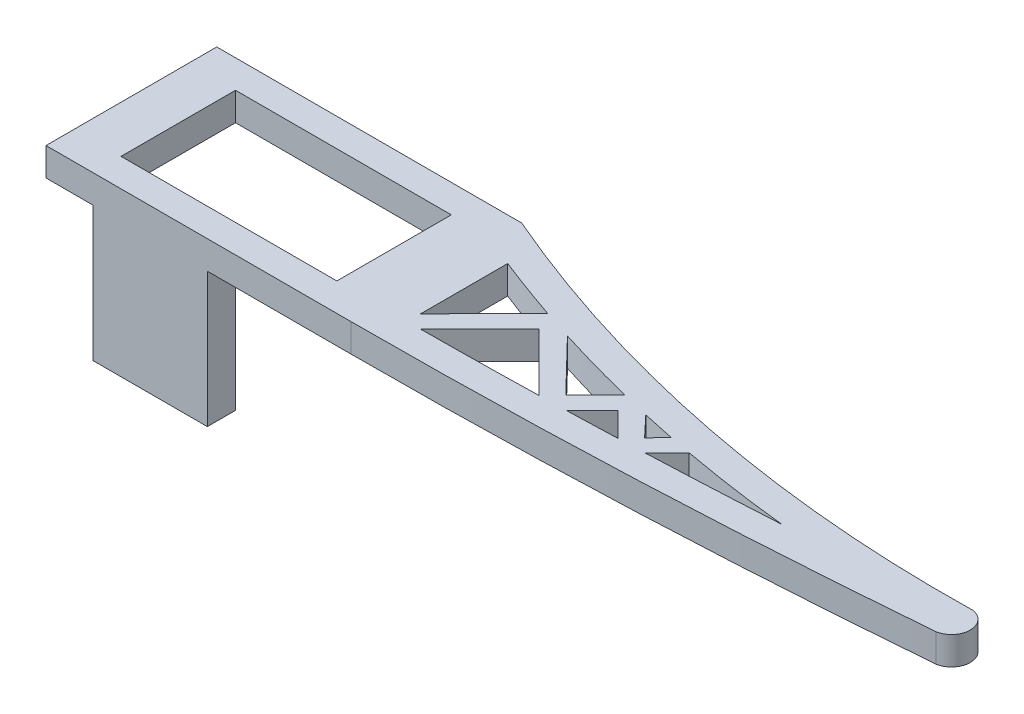
ISO-10303-21;
HEADER;
FILE_DESCRIPTION(('STEP AP214'),'2;1');
FILE_NAME('part.step','',(''),(''),'','','');
FILE_SCHEMA(('AUTOMOTIVE_DESIGN { 1 0 10303 214 1 1 1 1 }'));
ENDSEC;
DATA;
#1=APPLICATION_CONTEXT('core data for automotive mechanical design processes');
#2=APPLICATION_PROTOCOL_DEFINITION('international standard','automotive_design',2000,#1);
#3=PRODUCT_CONTEXT('',#1,'mechanical');
#4=PRODUCT('Part','Part','',(#3));
#5=PRODUCT_RELATED_PRODUCT_CATEGORY('part','',(#4));
#6=PRODUCT_DEFINITION_FORMATION('','',#4);
#7=PRODUCT_DEFINITION_CONTEXT('part definition',#1,'design');
#8=PRODUCT_DEFINITION('design','',#6,#7);
#9=PRODUCT_DEFINITION_SHAPE('','',#8);
#10=(LENGTH_UNIT() NAMED_UNIT(*) SI_UNIT(.MILLI.,.METRE.));
#11=(NAMED_UNIT(*) PLANE_ANGLE_UNIT() SI_UNIT($,.RADIAN.));
#12=(NAMED_UNIT(*) SI_UNIT($,.STERADIAN.) SOLID_ANGLE_UNIT());
#13=UNCERTAINTY_MEASURE_WITH_UNIT(LENGTH_MEASURE(1.E-05),#10,'distance_accuracy_value','');
#14=(GEOMETRIC_REPRESENTATION_CONTEXT(3) GLOBAL_UNCERTAINTY_ASSIGNED_CONTEXT((#13)) GLOBAL_UNIT_ASSIGNED_CONTEXT((#10,
#11,#12)) REPRESENTATION_CONTEXT('',''));
#15=CARTESIAN_POINT('',(0.,0.,0.));
#16=DIRECTION('',(0.,0.,1.));
#17=DIRECTION('',(1.,0.,0.));
#18=AXIS2_PLACEMENT_3D('',#15,#16,#17);
#19=CARTESIAN_POINT('',(16.25,0.,-692.267762496661));
#20=DIRECTION('',(0.,1.,0.));
#21=DIRECTION('',(0.,0.,1.));
#22=AXIS2_PLACEMENT_3D('',#19,#20,#21);
#23=PLANE('',#22);
#24=DIRECTION('',(0.70215886774458,0.,-0.712020311822387));
#25=VECTOR('',#24,1.);
#26=CARTESIAN_POINT('',(19.25,0.,4.57934188869029));
#27=LINE('',#26,#25);
#28=CARTESIAN_POINT('',(19.25,0.,4.57934188869025));
#29=VERTEX_POINT('',#28);
#30=CARTESIAN_POINT('',(25.977749380802,0.,-2.24289511782721));
#31=VERTEX_POINT('',#30);
#32=EDGE_CURVE('E458',#29,#31,#27,.T.);
#33=ORIENTED_EDGE('',*,*,#32,.T.);
#34=CARTESIAN_POINT('',(73.0415388145315,0.,-140.770806467442));
#35=DIRECTION('',(0.,-1.,0.));
#36=DIRECTION('',(0.,0.,1.));
#37=AXIS2_PLACEMENT_3D('',#34,#35,#36);
#38=CIRCLE('',#37,146.304417222274);
#39=CARTESIAN_POINT('',(19.25,0.,-4.71400637750197));
#40=VERTEX_POINT('',#39);
#41=EDGE_CURVE('E449',#31,#40,#38,.T.);
#42=ORIENTED_EDGE('',*,*,#41,.T.);
#43=DIRECTION('',(0.,0.,1.));
#44=VECTOR('',#43,1.);
#45=CARTESIAN_POINT('',(19.25,0.,-4.71400637750197));
#46=LINE('',#45,#44);
#47=EDGE_CURVE('E453',#40,#29,#46,.T.);
#48=ORIENTED_EDGE('',*,*,#47,.T.);
#49=EDGE_LOOP('',(#33,#42,#48));
#50=FACE_BOUND('',#49,.T.);
#51=DIRECTION('',(0.6855739045721,0.,0.728003036648725));
#52=VECTOR('',#51,1.);
#53=CARTESIAN_POINT('',(40.5625292952941,0.,1.88295772894521));
#54=LINE('',#53,#52);
#55=CARTESIAN_POINT('',(40.5625292952941,0.,1.8829577289452));
#56=VERTEX_POINT('',#55);
#57=CARTESIAN_POINT('',(42.638111064004,0.,4.08699411416416));
#58=VERTEX_POINT('',#57);
#59=EDGE_CURVE('E291',#56,#58,#54,.T.);
#60=ORIENTED_EDGE('',*,*,#59,.T.);
#61=DIRECTION('',(0.688032215754689,0.,-0.725680143095905));
#62=VECTOR('',#61,1.);
#63=CARTESIAN_POINT('',(42.638111064004,0.,4.08699411416416));
#64=LINE('',#63,#62);
#65=CARTESIAN_POINT('',(44.0225307638828,0.,2.62682137383555));
#66=VERTEX_POINT('',#65);
#67=EDGE_CURVE('E299',#58,#66,#64,.T.);
#68=ORIENTED_EDGE('',*,*,#67,.T.);
#69=CARTESIAN_POINT('',(73.0415388145315,0.,-140.770806467442));
#70=DIRECTION('',(0.,-1.,0.));
#71=DIRECTION('',(0.,0.,1.));
#72=AXIS2_PLACEMENT_3D('',#69,#70,#71);
#73=CIRCLE('',#72,146.304417222274);
#74=EDGE_CURVE('E310',#66,#56,#73,.T.);
#75=ORIENTED_EDGE('',*,*,#74,.T.);
#76=EDGE_LOOP('',(#60,#68,#75));
#77=FACE_BOUND('',#76,.T.);
#78=CARTESIAN_POINT('',(16.2499999999498,0.,-692.26776249783));
#79=DIRECTION('',(0.,1.,0.));
#80=DIRECTION('',(0.,0.,1.));
#81=AXIS2_PLACEMENT_3D('',#78,#79,#80);
#82=CIRCLE('',#81,698.26776249783);
#83=CARTESIAN_POINT('',(44.1095240356003,0.,5.44400826731389));
#84=VERTEX_POINT('',#83);
#85=CARTESIAN_POINT('',(57.9534950298761,0.,4.75353319263505));
#86=VERTEX_POINT('',#85);
#87=EDGE_CURVE('E387',#84,#86,#82,.T.);
#88=ORIENTED_EDGE('',*,*,#87,.T.);
#89=CARTESIAN_POINT('',(73.0415388145315,0.,-140.770806467442));
#90=DIRECTION('',(0.,-1.,0.));
#91=DIRECTION('',(0.,0.,1.));
#92=AXIS2_PLACEMENT_3D('',#89,#90,#91);
#93=CIRCLE('',#92,146.304417222274);
#94=CARTESIAN_POINT('',(46.3950479740729,0.,3.08657785688982));
#95=VERTEX_POINT('',#94);
#96=EDGE_CURVE('E400',#86,#95,#93,.T.);
#97=ORIENTED_EDGE('',*,*,#96,.T.);
#98=DIRECTION('',(-0.696072187513183,0.,0.717971802907755));
#99=VECTOR('',#98,1.);
#100=CARTESIAN_POINT('',(44.1095240356003,0.,5.444008267314));
#101=LINE('',#100,#99);
#102=EDGE_CURVE('E411',#95,#84,#101,.T.);
#103=ORIENTED_EDGE('',*,*,#102,.T.);
#104=EDGE_LOOP('',(#88,#97,#103));
#105=FACE_BOUND('',#104,.T.);
#106=CARTESIAN_POINT('',(16.2499999999498,0.,-692.26776249783));
#107=DIRECTION('',(0.,1.,0.));
#108=DIRECTION('',(0.,0.,1.));
#109=AXIS2_PLACEMENT_3D('',#106,#107,#108);
#110=CIRCLE('',#109,698.26776249783);
#111=CARTESIAN_POINT('',(20.6717695466051,0.,5.98599946683154));
#112=VERTEX_POINT('',#111);
#113=CARTESIAN_POINT('',(33.1196036039778,0.,5.79619203496862));
#114=VERTEX_POINT('',#113);
#115=EDGE_CURVE('E422',#112,#114,#110,.T.);
#116=ORIENTED_EDGE('',*,*,#115,.T.);
#117=DIRECTION('',(-0.70710678118655,0.,-0.707106781186545));
#118=VECTOR('',#117,1.);
#119=CARTESIAN_POINT('',(26.9905902912229,0.,-0.33282127778641));
#120=LINE('',#119,#118);
#121=CARTESIAN_POINT('',(26.9905902912229,0.,-0.33282127778641));
#122=VERTEX_POINT('',#121);
#123=EDGE_CURVE('E433',#114,#122,#120,.T.);
#124=ORIENTED_EDGE('',*,*,#123,.T.);
#125=DIRECTION('',(-0.707106781186539,0.,0.707106781186556));
#126=VECTOR('',#125,1.);
#127=CARTESIAN_POINT('',(20.671769546605,0.,5.98599946683159));
#128=LINE('',#127,#126);
#129=EDGE_CURVE('E442',#122,#112,#128,.T.);
#130=ORIENTED_EDGE('',*,*,#129,.T.);
#131=EDGE_LOOP('',(#116,#124,#130));
#132=FACE_BOUND('',#131,.T.);
#133=DIRECTION('',(0.695538394909189,0.,0.718488929077651));
#134=VECTOR('',#133,1.);
#135=CARTESIAN_POINT('',(29.1123972203652,0.,-1.21718588542754));
#136=LINE('',#135,#134);
#137=CARTESIAN_POINT('',(29.1123972203652,0.,-1.21718588542755));
#138=VERTEX_POINT('',#137);
#139=CARTESIAN_POINT('',(34.4991155487943,0.,4.34727685503876));
#140=VERTEX_POINT('',#139);
#141=EDGE_CURVE('E321',#138,#140,#136,.T.);
#142=ORIENTED_EDGE('',*,*,#141,.T.);
#143=DIRECTION('',(0.697490554621267,0.,-0.716593975842749));
#144=VECTOR('',#143,1.);
#145=CARTESIAN_POINT('',(34.4991155487943,0.,4.34727685503876));
#146=LINE('',#145,#144);
#147=CARTESIAN_POINT('',(37.5886614898829,0.,1.17311199387346));
#148=VERTEX_POINT('',#147);
#149=EDGE_CURVE('E332',#140,#148,#146,.T.);
#150=ORIENTED_EDGE('',*,*,#149,.T.);
#151=CARTESIAN_POINT('',(73.0415388145315,0.,-140.770806467442));
#152=DIRECTION('',(0.,-1.,0.));
#153=DIRECTION('',(0.,0.,1.));
#154=AXIS2_PLACEMENT_3D('',#151,#152,#153);
#155=CIRCLE('',#154,146.304417222274);
#156=EDGE_CURVE('E343',#148,#138,#155,.T.);
#157=ORIENTED_EDGE('',*,*,#156,.T.);
#158=EDGE_LOOP('',(#142,#150,#157));
#159=FACE_BOUND('',#158,.T.);
#160=CARTESIAN_POINT('',(16.2499999999498,0.,-692.26776249783));
#161=DIRECTION('',(0.,1.,0.));
#162=DIRECTION('',(0.,0.,1.));
#163=AXIS2_PLACEMENT_3D('',#160,#161,#162);
#164=CIRCLE('',#163,698.26776249783);
#165=CARTESIAN_POINT('',(35.9528501243553,0.,5.72196940422398));
#166=VERTEX_POINT('',#165);
#167=CARTESIAN_POINT('',(41.2741448321575,0.,5.551455007064));
#168=VERTEX_POINT('',#167);
#169=EDGE_CURVE('E354',#166,#168,#164,.T.);
#170=ORIENTED_EDGE('',*,*,#169,.T.);
#171=DIRECTION('',(-0.707106781186517,0.,-0.707106781186578));
#172=VECTOR('',#171,1.);
#173=CARTESIAN_POINT('',(38.6987546768364,0.,2.97606485174279));
#174=LINE('',#173,#172);
#175=CARTESIAN_POINT('',(38.6987546768364,0.,2.97606485174279));
#176=VERTEX_POINT('',#175);
#177=EDGE_CURVE('E365',#168,#176,#174,.T.);
#178=ORIENTED_EDGE('',*,*,#177,.T.);
#179=DIRECTION('',(-0.707106781186534,0.,0.707106781186561));
#180=VECTOR('',#179,1.);
#181=CARTESIAN_POINT('',(35.9528501243553,0.,5.72196940422404));
#182=LINE('',#181,#180);
#183=EDGE_CURVE('E376',#176,#166,#182,.T.);
#184=ORIENTED_EDGE('',*,*,#183,.T.);
#185=EDGE_LOOP('',(#170,#178,#184));
#186=FACE_BOUND('',#185,.T.);
#187=DIRECTION('',(0.,0.,-1.));
#188=VECTOR('',#187,1.);
#189=CARTESIAN_POINT('',(-11.25,0.,5.99999999999999));
#190=LINE('',#189,#188);
#191=CARTESIAN_POINT('',(-11.25,0.,9.));
#192=VERTEX_POINT('',#191);
#193=CARTESIAN_POINT('',(-11.25,0.,5.99999999999999));
#194=VERTEX_POINT('',#193);
#195=EDGE_CURVE('E68',#192,#194,#190,.T.);
#196=ORIENTED_EDGE('',*,*,#195,.F.);
#197=DIRECTION('',(1.,0.,0.));
#198=VECTOR('',#197,1.);
#199=CARTESIAN_POINT('',(-16.25,0.,9.));
#200=LINE('',#199,#198);
#201=CARTESIAN_POINT('',(-16.25,0.,9.));
#202=VERTEX_POINT('',#201);
#203=EDGE_CURVE('E548',#202,#192,#200,.T.);
#204=ORIENTED_EDGE('',*,*,#203,.F.);
#205=DIRECTION('',(0.,0.,1.));
#206=VECTOR('',#205,1.);
#207=CARTESIAN_POINT('',(-16.25,0.,-9.2));
#208=LINE('',#207,#206);
#209=CARTESIAN_POINT('',(-16.25,0.,-9.2));
#210=VERTEX_POINT('',#209);
#211=EDGE_CURVE('E522',#210,#202,#208,.T.);
#212=ORIENTED_EDGE('',*,*,#211,.F.);
#213=DIRECTION('',(-1.,0.,0.));
#214=VECTOR('',#213,1.);
#215=CARTESIAN_POINT('',(-16.25,0.,-9.2));
#216=LINE('',#215,#214);
#217=CARTESIAN_POINT('',(16.25,0.,-9.2));
#218=VERTEX_POINT('',#217);
#219=EDGE_CURVE('E528',#218,#210,#216,.T.);
#220=ORIENTED_EDGE('',*,*,#219,.F.);
#221=CARTESIAN_POINT('',(73.0415388145316,0.,-140.770806467443));
#222=DIRECTION('',(0.,-1.,0.));
#223=DIRECTION('',(0.,0.,1.));
#224=AXIS2_PLACEMENT_3D('',#221,#222,#223);
#225=CIRCLE('',#224,143.304417222274);
#226=CARTESIAN_POINT('',(76.0730564628563,0.,2.50154221213891));
#227=VERTEX_POINT('',#226);
#228=EDGE_CURVE('E557',#227,#218,#225,.T.);
#229=ORIENTED_EDGE('',*,*,#228,.F.);
#230=CARTESIAN_POINT('',(75.7340992531813,0.,4.4726099456299));
#231=DIRECTION('',(0.,1.,0.));
#232=DIRECTION('',(0.,0.,1.));
#233=AXIS2_PLACEMENT_3D('',#230,#231,#232);
#234=CIRCLE('',#233,2.);
#235=CARTESIAN_POINT('',(76.0730564628563,0.,6.44367767912089));
#236=VERTEX_POINT('',#235);
#237=EDGE_CURVE('E554',#236,#227,#234,.T.);
#238=ORIENTED_EDGE('',*,*,#237,.F.);
#239=CARTESIAN_POINT('',(16.25,0.,-692.267762496661));
#240=DIRECTION('',(0.,1.,0.));
#241=DIRECTION('',(0.,0.,1.));
#242=AXIS2_PLACEMENT_3D('',#239,#240,#241);
#243=CIRCLE('',#242,701.267762496661);
#244=CARTESIAN_POINT('',(16.25,0.,9.00000000000001));
#245=VERTEX_POINT('',#244);
#246=EDGE_CURVE('E551',#245,#236,#243,.T.);
#247=ORIENTED_EDGE('',*,*,#246,.F.);
#248=CARTESIAN_POINT('',(0.950000000000001,0.,9.));
#249=VERTEX_POINT('',#248);
#250=EDGE_CURVE('E547',#249,#245,#200,.T.);
#251=ORIENTED_EDGE('',*,*,#250,.F.);
#252=DIRECTION('',(0.,0.,1.));
#253=VECTOR('',#252,1.);
#254=CARTESIAN_POINT('',(0.950000000000001,0.,5.99999999999999));
#255=LINE('',#254,#253);
#256=CARTESIAN_POINT('',(0.950000000000001,0.,5.99999999999999));
#257=VERTEX_POINT('',#256);
#258=EDGE_CURVE('E61',#257,#249,#255,.T.);
#259=ORIENTED_EDGE('',*,*,#258,.F.);
#260=DIRECTION('',(1.,0.,0.));
#261=VECTOR('',#260,1.);
#262=CARTESIAN_POINT('',(-11.25,0.,5.99999999999999));
#263=LINE('',#262,#261);
#264=CARTESIAN_POINT('',(11.75,0.,5.99999999999999));
#265=VERTEX_POINT('',#264);
#266=EDGE_CURVE('E499',#257,#265,#263,.T.);
#267=ORIENTED_EDGE('',*,*,#266,.T.);
#268=DIRECTION('',(0.,0.,-1.));
#269=VECTOR('',#268,1.);
#270=CARTESIAN_POINT('',(11.75,0.,-6.2));
#271=LINE('',#270,#269);
#272=CARTESIAN_POINT('',(11.75,0.,-6.2));
#273=VERTEX_POINT('',#272);
#274=EDGE_CURVE('E502',#265,#273,#271,.T.);
#275=ORIENTED_EDGE('',*,*,#274,.T.);
#276=DIRECTION('',(-1.,0.,0.));
#277=VECTOR('',#276,1.);
#278=CARTESIAN_POINT('',(-11.25,0.,-6.2));
#279=LINE('',#278,#277);
#280=CARTESIAN_POINT('',(-11.25,0.,-6.19999999999998));
#281=VERTEX_POINT('',#280);
#282=EDGE_CURVE('E486',#273,#281,#279,.T.);
#283=ORIENTED_EDGE('',*,*,#282,.T.);
#284=DIRECTION('',(0.,0.,1.));
#285=VECTOR('',#284,1.);
#286=CARTESIAN_POINT('',(-11.25,0.,-6.2));
#287=LINE('',#286,#285);
#288=EDGE_CURVE('E475',#281,#194,#287,.T.);
#289=ORIENTED_EDGE('',*,*,#288,.T.);
#290=EDGE_LOOP('',(#196,#204,#212,#220,#229,#238,#247,#251,#259,#267,#275,#283,#289));
#291=FACE_BOUND('',#290,.T.);
#292=ADVANCED_FACE('F45',(#50,#77,#105,#132,#159,#186,#291),#23,.F.);
#293=CARTESIAN_POINT('',(16.25,3.,-692.267762496661));
#294=DIRECTION('',(0.,1.,0.));
#295=DIRECTION('',(0.,0.,1.));
#296=AXIS2_PLACEMENT_3D('',#293,#294,#295);
#297=PLANE('',#296);
#298=DIRECTION('',(-0.707106781186517,0.,-0.707106781186578));
#299=VECTOR('',#298,1.);
#300=CARTESIAN_POINT('',(38.6987546768364,3.,2.97606485174279));
#301=LINE('',#300,#299);
#302=CARTESIAN_POINT('',(41.2741448321575,3.,5.551455007064));
#303=VERTEX_POINT('',#302);
#304=CARTESIAN_POINT('',(38.6987546768364,3.,2.97606485174284));
#305=VERTEX_POINT('',#304);
#306=EDGE_CURVE('E369',#303,#305,#301,.T.);
#307=ORIENTED_EDGE('',*,*,#306,.F.);
#308=CARTESIAN_POINT('',(16.2499999999498,3.,-692.26776249783));
#309=DIRECTION('',(0.,1.,0.));
#310=DIRECTION('',(0.,0.,1.));
#311=AXIS2_PLACEMENT_3D('',#308,#309,#310);
#312=CIRCLE('',#311,698.26776249783);
#313=CARTESIAN_POINT('',(35.9528501243553,3.,5.72196940422404));
#314=VERTEX_POINT('',#313);
#315=EDGE_CURVE('E360',#314,#303,#312,.T.);
#316=ORIENTED_EDGE('',*,*,#315,.F.);
#317=DIRECTION('',(-0.707106781186534,0.,0.707106781186561));
#318=VECTOR('',#317,1.);
#319=CARTESIAN_POINT('',(35.9528501243553,3.,5.72196940422404));
#320=LINE('',#319,#318);
#321=EDGE_CURVE('E364',#305,#314,#320,.T.);
#322=ORIENTED_EDGE('',*,*,#321,.F.);
#323=EDGE_LOOP('',(#307,#316,#322));
#324=FACE_BOUND('',#323,.T.);
#325=DIRECTION('',(0.697490554621267,0.,-0.716593975842749));
#326=VECTOR('',#325,1.);
#327=CARTESIAN_POINT('',(34.4991155487943,3.,4.34727685503876));
#328=LINE('',#327,#326);
#329=CARTESIAN_POINT('',(34.4991155487943,3.,4.34727685503876));
#330=VERTEX_POINT('',#329);
#331=CARTESIAN_POINT('',(37.5886614898829,3.,1.17311199387346));
#332=VERTEX_POINT('',#331);
#333=EDGE_CURVE('E336',#330,#332,#328,.T.);
#334=ORIENTED_EDGE('',*,*,#333,.F.);
#335=DIRECTION('',(0.695538394909189,0.,0.718488929077651));
#336=VECTOR('',#335,1.);
#337=CARTESIAN_POINT('',(29.1123972203652,3.,-1.21718588542754));
#338=LINE('',#337,#336);
#339=CARTESIAN_POINT('',(29.1123972203652,3.,-1.21718588542754));
#340=VERTEX_POINT('',#339);
#341=EDGE_CURVE('E327',#340,#330,#338,.T.);
#342=ORIENTED_EDGE('',*,*,#341,.F.);
#343=CARTESIAN_POINT('',(73.0415388145315,3.,-140.770806467442));
#344=DIRECTION('',(0.,-1.,0.));
#345=DIRECTION('',(0.,0.,1.));
#346=AXIS2_PLACEMENT_3D('',#343,#344,#345);
#347=CIRCLE('',#346,146.304417222274);
#348=EDGE_CURVE('E331',#332,#340,#347,.T.);
#349=ORIENTED_EDGE('',*,*,#348,.F.);
#350=EDGE_LOOP('',(#334,#342,#349));
#351=FACE_BOUND('',#350,.T.);
#352=DIRECTION('',(-0.70710678118655,0.,-0.707106781186545));
#353=VECTOR('',#352,1.);
#354=CARTESIAN_POINT('',(26.9905902912229,3.,-0.33282127778641));
#355=LINE('',#354,#353);
#356=CARTESIAN_POINT('',(33.1196036039778,3.,5.79619203496862));
#357=VERTEX_POINT('',#356);
#358=CARTESIAN_POINT('',(26.9905902912229,3.,-0.332821277786388));
#359=VERTEX_POINT('',#358);
#360=EDGE_CURVE('E394',#357,#359,#355,.T.);
#361=ORIENTED_EDGE('',*,*,#360,.F.);
#362=CARTESIAN_POINT('',(16.2499999999498,3.,-692.26776249783));
#363=DIRECTION('',(0.,1.,0.));
#364=DIRECTION('',(0.,0.,1.));
#365=AXIS2_PLACEMENT_3D('',#362,#363,#364);
#366=CIRCLE('',#365,698.26776249783);
#367=CARTESIAN_POINT('',(20.671769546605,3.,5.98599946683159));
#368=VERTEX_POINT('',#367);
#369=EDGE_CURVE('E428',#368,#357,#366,.T.);
#370=ORIENTED_EDGE('',*,*,#369,.F.);
#371=DIRECTION('',(-0.707106781186539,0.,0.707106781186556));
#372=VECTOR('',#371,1.);
#373=CARTESIAN_POINT('',(20.671769546605,3.,5.98599946683159));
#374=LINE('',#373,#372);
#375=EDGE_CURVE('E432',#359,#368,#374,.T.);
#376=ORIENTED_EDGE('',*,*,#375,.F.);
#377=EDGE_LOOP('',(#361,#370,#376));
#378=FACE_BOUND('',#377,.T.);
#379=CARTESIAN_POINT('',(73.0415388145315,3.,-140.770806467442));
#380=DIRECTION('',(0.,-1.,0.));
#381=DIRECTION('',(0.,0.,1.));
#382=AXIS2_PLACEMENT_3D('',#379,#380,#381);
#383=CIRCLE('',#382,146.304417222274);
#384=CARTESIAN_POINT('',(57.9534950298761,3.,4.75353319263505));
#385=VERTEX_POINT('',#384);
#386=CARTESIAN_POINT('',(46.3950479740728,3.,3.08657785688987));
#387=VERTEX_POINT('',#386);
#388=EDGE_CURVE('E404',#385,#387,#383,.T.);
#389=ORIENTED_EDGE('',*,*,#388,.F.);
#390=CARTESIAN_POINT('',(16.2499999999498,3.,-692.26776249783));
#391=DIRECTION('',(0.,1.,0.));
#392=DIRECTION('',(0.,0.,1.));
#393=AXIS2_PLACEMENT_3D('',#390,#391,#392);
#394=CIRCLE('',#393,698.26776249783);
#395=CARTESIAN_POINT('',(44.1095240356003,3.,5.44400826731395));
#396=VERTEX_POINT('',#395);
#397=EDGE_CURVE('E395',#396,#385,#394,.T.);
#398=ORIENTED_EDGE('',*,*,#397,.F.);
#399=DIRECTION('',(-0.696072187513183,0.,0.717971802907755));
#400=VECTOR('',#399,1.);
#401=CARTESIAN_POINT('',(44.1095240356003,3.,5.444008267314));
#402=LINE('',#401,#400);
#403=EDGE_CURVE('E399',#387,#396,#402,.T.);
#404=ORIENTED_EDGE('',*,*,#403,.F.);
#405=EDGE_LOOP('',(#389,#398,#404));
#406=FACE_BOUND('',#405,.T.);
#407=DIRECTION('',(0.688032215754689,0.,-0.725680143095905));
#408=VECTOR('',#407,1.);
#409=CARTESIAN_POINT('',(42.638111064004,3.,4.08699411416416));
#410=LINE('',#409,#408);
#411=CARTESIAN_POINT('',(42.638111064004,3.,4.08699411416416));
#412=VERTEX_POINT('',#411);
#413=CARTESIAN_POINT('',(44.0225307638828,3.,2.62682137383555));
#414=VERTEX_POINT('',#413);
#415=EDGE_CURVE('E303',#412,#414,#410,.T.);
#416=ORIENTED_EDGE('',*,*,#415,.F.);
#417=DIRECTION('',(0.6855739045721,0.,0.728003036648725));
#418=VECTOR('',#417,1.);
#419=CARTESIAN_POINT('',(40.5625292952941,3.,1.88295772894521));
#420=LINE('',#419,#418);
#421=CARTESIAN_POINT('',(40.5625292952941,3.,1.88295772894521));
#422=VERTEX_POINT('',#421);
#423=EDGE_CURVE('E294',#422,#412,#420,.T.);
#424=ORIENTED_EDGE('',*,*,#423,.F.);
#425=CARTESIAN_POINT('',(73.0415388145315,3.,-140.770806467442));
#426=DIRECTION('',(0.,-1.,0.));
#427=DIRECTION('',(0.,0.,1.));
#428=AXIS2_PLACEMENT_3D('',#425,#426,#427);
#429=CIRCLE('',#428,146.304417222274);
#430=EDGE_CURVE('E298',#414,#422,#429,.T.);
#431=ORIENTED_EDGE('',*,*,#430,.F.);
#432=EDGE_LOOP('',(#416,#424,#431));
#433=FACE_BOUND('',#432,.T.);
#434=CARTESIAN_POINT('',(73.0415388145315,3.,-140.770806467442));
#435=DIRECTION('',(0.,-1.,0.));
#436=DIRECTION('',(0.,0.,1.));
#437=AXIS2_PLACEMENT_3D('',#434,#435,#436);
#438=CIRCLE('',#437,146.304417222274);
#439=CARTESIAN_POINT('',(25.977749380802,3.,-2.24289511782721));
#440=VERTEX_POINT('',#439);
#441=CARTESIAN_POINT('',(19.25,3.,-4.71400637750197));
#442=VERTEX_POINT('',#441);
#443=EDGE_CURVE('E407',#440,#442,#438,.T.);
#444=ORIENTED_EDGE('',*,*,#443,.F.);
#445=DIRECTION('',(0.70215886774458,0.,-0.712020311822387));
#446=VECTOR('',#445,1.);
#447=CARTESIAN_POINT('',(19.25,3.,4.57934188869029));
#448=LINE('',#447,#446);
#449=CARTESIAN_POINT('',(19.25,3.,4.57934188869029));
#450=VERTEX_POINT('',#449);
#451=EDGE_CURVE('E454',#450,#440,#448,.T.);
#452=ORIENTED_EDGE('',*,*,#451,.F.);
#453=DIRECTION('',(0.,0.,1.));
#454=VECTOR('',#453,1.);
#455=CARTESIAN_POINT('',(19.25,3.,-4.71400637750197));
#456=LINE('',#455,#454);
#457=EDGE_CURVE('E465',#442,#450,#456,.T.);
#458=ORIENTED_EDGE('',*,*,#457,.F.);
#459=EDGE_LOOP('',(#444,#452,#458));
#460=FACE_BOUND('',#459,.T.);
#461=DIRECTION('',(0.,0.,1.));
#462=VECTOR('',#461,1.);
#463=CARTESIAN_POINT('',(-16.25,3.,-9.2));
#464=LINE('',#463,#462);
#465=CARTESIAN_POINT('',(-16.25,3.,-9.2));
#466=VERTEX_POINT('',#465);
#467=CARTESIAN_POINT('',(-16.25,3.,9.));
#468=VERTEX_POINT('',#467);
#469=EDGE_CURVE('E523',#466,#468,#464,.T.);
#470=ORIENTED_EDGE('',*,*,#469,.T.);
#471=DIRECTION('',(1.,0.,0.));
#472=VECTOR('',#471,1.);
#473=CARTESIAN_POINT('',(-16.25,3.,9.));
#474=LINE('',#473,#472);
#475=CARTESIAN_POINT('',(16.25,3.,9.00000000000001));
#476=VERTEX_POINT('',#475);
#477=EDGE_CURVE('E527',#468,#476,#474,.T.);
#478=ORIENTED_EDGE('',*,*,#477,.T.);
#479=CARTESIAN_POINT('',(16.25,3.,-692.267762496661));
#480=DIRECTION('',(0.,1.,0.));
#481=DIRECTION('',(0.,0.,1.));
#482=AXIS2_PLACEMENT_3D('',#479,#480,#481);
#483=CIRCLE('',#482,701.267762496661);
#484=CARTESIAN_POINT('',(76.0730564628563,3.,6.44367767912089));
#485=VERTEX_POINT('',#484);
#486=EDGE_CURVE('E531',#476,#485,#483,.T.);
#487=ORIENTED_EDGE('',*,*,#486,.T.);
#488=CARTESIAN_POINT('',(75.7340992531813,3.,4.4726099456299));
#489=DIRECTION('',(0.,1.,0.));
#490=DIRECTION('',(0.,0.,1.));
#491=AXIS2_PLACEMENT_3D('',#488,#489,#490);
#492=CIRCLE('',#491,2.);
#493=CARTESIAN_POINT('',(76.0730564628563,3.,2.50154221213891));
#494=VERTEX_POINT('',#493);
#495=EDGE_CURVE('E534',#485,#494,#492,.T.);
#496=ORIENTED_EDGE('',*,*,#495,.T.);
#497=CARTESIAN_POINT('',(73.0415388145316,3.,-140.770806467443));
#498=DIRECTION('',(0.,-1.,0.));
#499=DIRECTION('',(0.,0.,1.));
#500=AXIS2_PLACEMENT_3D('',#497,#498,#499);
#501=CIRCLE('',#500,143.304417222274);
#502=CARTESIAN_POINT('',(16.25,3.,-9.2));
#503=VERTEX_POINT('',#502);
#504=EDGE_CURVE('E537',#494,#503,#501,.T.);
#505=ORIENTED_EDGE('',*,*,#504,.T.);
#506=DIRECTION('',(-1.,0.,0.));
#507=VECTOR('',#506,1.);
#508=CARTESIAN_POINT('',(-16.25,3.,-9.2));
#509=LINE('',#508,#507);
#510=EDGE_CURVE('E540',#503,#466,#509,.T.);
#511=ORIENTED_EDGE('',*,*,#510,.T.);
#512=EDGE_LOOP('',(#470,#478,#487,#496,#505,#511));
#513=FACE_BOUND('',#512,.T.);
#514=DIRECTION('',(1.,0.,0.));
#515=VECTOR('',#514,1.);
#516=CARTESIAN_POINT('',(-11.25,3.,5.99999999999999));
#517=LINE('',#516,#515);
#518=CARTESIAN_POINT('',(-11.25,3.,5.99999999999999));
#519=VERTEX_POINT('',#518);
#520=CARTESIAN_POINT('',(11.75,3.,5.99999999999999));
#521=VERTEX_POINT('',#520);
#522=EDGE_CURVE('E485',#519,#521,#517,.T.);
#523=ORIENTED_EDGE('',*,*,#522,.F.);
#524=DIRECTION('',(0.,0.,1.));
#525=VECTOR('',#524,1.);
#526=CARTESIAN_POINT('',(-11.25,3.,-6.2));
#527=LINE('',#526,#525);
#528=CARTESIAN_POINT('',(-11.25,3.,-6.2));
#529=VERTEX_POINT('',#528);
#530=EDGE_CURVE('E482',#529,#519,#527,.T.);
#531=ORIENTED_EDGE('',*,*,#530,.F.);
#532=DIRECTION('',(-1.,0.,0.));
#533=VECTOR('',#532,1.);
#534=CARTESIAN_POINT('',(-11.25,3.,-6.2));
#535=LINE('',#534,#533);
#536=CARTESIAN_POINT('',(11.75,3.,-6.19999999999998));
#537=VERTEX_POINT('',#536);
#538=EDGE_CURVE('E493',#537,#529,#535,.T.);
#539=ORIENTED_EDGE('',*,*,#538,.F.);
#540=DIRECTION('',(0.,0.,-1.));
#541=VECTOR('',#540,1.);
#542=CARTESIAN_POINT('',(11.75,3.,-6.2));
#543=LINE('',#542,#541);
#544=EDGE_CURVE('E489',#521,#537,#543,.T.);
#545=ORIENTED_EDGE('',*,*,#544,.F.);
#546=EDGE_LOOP('',(#523,#531,#539,#545));
#547=FACE_BOUND('',#546,.T.);
#548=ADVANCED_FACE('F598',(#324,#351,#378,#406,#433,#460,#513,#547),#297,.T.);
#549=CARTESIAN_POINT('',(-16.25,3.,-9.2));
#550=DIRECTION('',(1.,0.,0.));
#551=DIRECTION('',(0.,0.,-1.));
#552=AXIS2_PLACEMENT_3D('',#549,#550,#551);
#553=PLANE('',#552);
#554=ORIENTED_EDGE('',*,*,#211,.T.);
#555=DIRECTION('',(0.,-1.,0.));
#556=VECTOR('',#555,1.);
#557=CARTESIAN_POINT('',(-16.25,3.,9.));
#558=LINE('',#557,#556);
#559=EDGE_CURVE('E11',#468,#202,#558,.T.);
#560=ORIENTED_EDGE('',*,*,#559,.F.);
#561=ORIENTED_EDGE('',*,*,#469,.F.);
#562=DIRECTION('',(0.,-1.,0.));
#563=VECTOR('',#562,1.);
#564=CARTESIAN_POINT('',(-16.25,3.,-9.2));
#565=LINE('',#564,#563);
#566=EDGE_CURVE('E543',#466,#210,#565,.T.);
#567=ORIENTED_EDGE('',*,*,#566,.T.);
#568=EDGE_LOOP('',(#554,#560,#561,#567));
#569=FACE_BOUND('',#568,.T.);
#570=ADVANCED_FACE('F47',(#569),#553,.F.);
#571=CARTESIAN_POINT('',(-16.25,3.,9.));
#572=DIRECTION('',(0.,0.,-1.));
#573=DIRECTION('',(-1.,0.,0.));
#574=AXIS2_PLACEMENT_3D('',#571,#572,#573);
#575=PLANE('',#574);
#576=ORIENTED_EDGE('',*,*,#203,.T.);
#577=DIRECTION('',(0.,1.,0.));
#578=VECTOR('',#577,1.);
#579=CARTESIAN_POINT('',(-11.25,-14.35,9.00000000000001));
#580=LINE('',#579,#578);
#581=CARTESIAN_POINT('',(-11.25,-14.35,9.00000000000001));
#582=VERTEX_POINT('',#581);
#583=EDGE_CURVE('E928',#582,#192,#580,.T.);
#584=ORIENTED_EDGE('',*,*,#583,.F.);
#585=DIRECTION('',(-1.,0.,0.));
#586=VECTOR('',#585,1.);
#587=CARTESIAN_POINT('',(-11.25,-14.35,9.00000000000001));
#588=LINE('',#587,#586);
#589=CARTESIAN_POINT('',(0.950000000000001,-14.35,9.));
#590=VERTEX_POINT('',#589);
#591=EDGE_CURVE('E269',#590,#582,#588,.T.);
#592=ORIENTED_EDGE('',*,*,#591,.F.);
#593=DIRECTION('',(0.,1.,0.));
#594=VECTOR('',#593,1.);
#595=CARTESIAN_POINT('',(0.950000000000001,-14.35,9.));
#596=LINE('',#595,#594);
#597=EDGE_CURVE('E283',#590,#249,#596,.T.);
#598=ORIENTED_EDGE('',*,*,#597,.T.);
#599=ORIENTED_EDGE('',*,*,#250,.T.);
#600=DIRECTION('',(0.,-1.,0.));
#601=VECTOR('',#600,1.);
#602=CARTESIAN_POINT('',(16.25,3.,9.00000000000001));
#603=LINE('',#602,#601);
#604=EDGE_CURVE('E54',#476,#245,#603,.T.);
#605=ORIENTED_EDGE('',*,*,#604,.F.);
#606=ORIENTED_EDGE('',*,*,#477,.F.);
#607=ORIENTED_EDGE('',*,*,#559,.T.);
#608=EDGE_LOOP('',(#576,#584,#592,#598,#599,#605,#606,#607));
#609=FACE_BOUND('',#608,.T.);
#610=ADVANCED_FACE('F603',(#609),#575,.F.);
#611=CARTESIAN_POINT('',(16.25,3.,-692.267762496661));
#612=DIRECTION('',(0.,-1.,0.));
#613=DIRECTION('',(0.,0.,-1.));
#614=AXIS2_PLACEMENT_3D('',#611,#612,#613);
#615=CYLINDRICAL_SURFACE('',#614,701.267762496661);
#616=ORIENTED_EDGE('',*,*,#246,.T.);
#617=DIRECTION('',(0.,-1.,0.));
#618=VECTOR('',#617,1.);
#619=CARTESIAN_POINT('',(76.0730564628563,3.,6.44367767912089));
#620=LINE('',#619,#618);
#621=EDGE_CURVE('E573',#485,#236,#620,.T.);
#622=ORIENTED_EDGE('',*,*,#621,.F.);
#623=ORIENTED_EDGE('',*,*,#486,.F.);
#624=ORIENTED_EDGE('',*,*,#604,.T.);
#625=EDGE_LOOP('',(#616,#622,#623,#624));
#626=FACE_BOUND('',#625,.T.);
#627=ADVANCED_FACE('F582',(#626),#615,.T.);
#628=CARTESIAN_POINT('',(75.7340992531813,3.,4.4726099456299));
#629=DIRECTION('',(0.,-1.,0.));
#630=DIRECTION('',(0.,0.,-1.));
#631=AXIS2_PLACEMENT_3D('',#628,#629,#630);
#632=CYLINDRICAL_SURFACE('',#631,2.);
#633=ORIENTED_EDGE('',*,*,#237,.T.);
#634=DIRECTION('',(0.,-1.,0.));
#635=VECTOR('',#634,1.);
#636=CARTESIAN_POINT('',(76.0730564628563,3.,2.50154221213891));
#637=LINE('',#636,#635);
#638=EDGE_CURVE('E569',#494,#227,#637,.T.);
#639=ORIENTED_EDGE('',*,*,#638,.F.);
#640=ORIENTED_EDGE('',*,*,#495,.F.);
#641=ORIENTED_EDGE('',*,*,#621,.T.);
#642=EDGE_LOOP('',(#633,#639,#640,#641));
#643=FACE_BOUND('',#642,.T.);
#644=ADVANCED_FACE('F590',(#643),#632,.T.);
#645=CARTESIAN_POINT('',(73.0415388145316,3.,-140.770806467443));
#646=DIRECTION('',(0.,-1.,0.));
#647=DIRECTION('',(0.,0.,-1.));
#648=AXIS2_PLACEMENT_3D('',#645,#646,#647);
#649=CYLINDRICAL_SURFACE('',#648,143.304417222274);
#650=ORIENTED_EDGE('',*,*,#228,.T.);
#651=DIRECTION('',(0.,-1.,0.));
#652=VECTOR('',#651,1.);
#653=CARTESIAN_POINT('',(16.25,3.,-9.2));
#654=LINE('',#653,#652);
#655=EDGE_CURVE('E565',#503,#218,#654,.T.);
#656=ORIENTED_EDGE('',*,*,#655,.F.);
#657=ORIENTED_EDGE('',*,*,#504,.F.);
#658=ORIENTED_EDGE('',*,*,#638,.T.);
#659=EDGE_LOOP('',(#650,#656,#657,#658));
#660=FACE_BOUND('',#659,.T.);
#661=ADVANCED_FACE('F594',(#660),#649,.F.);
#662=CARTESIAN_POINT('',(-16.25,3.,-9.2));
#663=DIRECTION('',(0.,0.,1.));
#664=DIRECTION('',(1.,0.,0.));
#665=AXIS2_PLACEMENT_3D('',#662,#663,#664);
#666=PLANE('',#665);
#667=ORIENTED_EDGE('',*,*,#219,.T.);
#668=ORIENTED_EDGE('',*,*,#566,.F.);
#669=ORIENTED_EDGE('',*,*,#510,.F.);
#670=ORIENTED_EDGE('',*,*,#655,.T.);
#671=EDGE_LOOP('',(#667,#668,#669,#670));
#672=FACE_BOUND('',#671,.T.);
#673=ADVANCED_FACE('F607',(#672),#666,.F.);
#674=CARTESIAN_POINT('',(-11.25,3.,-6.2));
#675=DIRECTION('',(1.,0.,0.));
#676=DIRECTION('',(0.,0.,-1.));
#677=AXIS2_PLACEMENT_3D('',#674,#675,#676);
#678=PLANE('',#677);
#679=ORIENTED_EDGE('',*,*,#288,.F.);
#680=DIRECTION('',(0.,-1.,0.));
#681=VECTOR('',#680,1.);
#682=CARTESIAN_POINT('',(-11.25,3.,-6.2));
#683=LINE('',#682,#681);
#684=EDGE_CURVE('E496',#529,#281,#683,.T.);
#685=ORIENTED_EDGE('',*,*,#684,.F.);
#686=ORIENTED_EDGE('',*,*,#530,.T.);
#687=DIRECTION('',(0.,-1.,0.));
#688=VECTOR('',#687,1.);
#689=CARTESIAN_POINT('',(-11.25,3.,5.99999999999999));
#690=LINE('',#689,#688);
#691=EDGE_CURVE('E519',#519,#194,#690,.T.);
#692=ORIENTED_EDGE('',*,*,#691,.T.);
#693=EDGE_LOOP('',(#679,#685,#686,#692));
#694=FACE_BOUND('',#693,.T.);
#695=ADVANCED_FACE('F609',(#694),#678,.T.);
#696=CARTESIAN_POINT('',(-11.25,3.,5.99999999999999));
#697=DIRECTION('',(0.,0.,-1.));
#698=DIRECTION('',(-1.,0.,0.));
#699=AXIS2_PLACEMENT_3D('',#696,#697,#698);
#700=PLANE('',#699);
#701=ORIENTED_EDGE('',*,*,#266,.F.);
#702=DIRECTION('',(0.,1.,0.));
#703=VECTOR('',#702,1.);
#704=CARTESIAN_POINT('',(0.950000000000001,-14.35,5.99999999999999));
#705=LINE('',#704,#703);
#706=CARTESIAN_POINT('',(0.950000000000001,-14.35,5.99999999999999));
#707=VERTEX_POINT('',#706);
#708=EDGE_CURVE('E259',#707,#257,#705,.T.);
#709=ORIENTED_EDGE('',*,*,#708,.F.);
#710=DIRECTION('',(1.,0.,0.));
#711=VECTOR('',#710,1.);
#712=CARTESIAN_POINT('',(-11.25,-14.35,5.99999999999999));
#713=LINE('',#712,#711);
#714=CARTESIAN_POINT('',(-11.25,-14.35,5.99999999999999));
#715=VERTEX_POINT('',#714);
#716=EDGE_CURVE('E252',#715,#707,#713,.T.);
#717=ORIENTED_EDGE('',*,*,#716,.F.);
#718=DIRECTION('',(0.,1.,0.));
#719=VECTOR('',#718,1.);
#720=CARTESIAN_POINT('',(-11.25,-14.35,5.99999999999999));
#721=LINE('',#720,#719);
#722=EDGE_CURVE('E257',#715,#194,#721,.T.);
#723=ORIENTED_EDGE('',*,*,#722,.T.);
#724=ORIENTED_EDGE('',*,*,#691,.F.);
#725=ORIENTED_EDGE('',*,*,#522,.T.);
#726=DIRECTION('',(0.,-1.,0.));
#727=VECTOR('',#726,1.);
#728=CARTESIAN_POINT('',(11.75,3.,5.99999999999999));
#729=LINE('',#728,#727);
#730=EDGE_CURVE('E515',#521,#265,#729,.T.);
#731=ORIENTED_EDGE('',*,*,#730,.T.);
#732=EDGE_LOOP('',(#701,#709,#717,#723,#724,#725,#731));
#733=FACE_BOUND('',#732,.T.);
#734=ADVANCED_FACE('F254',(#733),#700,.T.);
#735=CARTESIAN_POINT('',(11.75,3.,-6.2));
#736=DIRECTION('',(-1.,0.,0.));
#737=DIRECTION('',(0.,0.,1.));
#738=AXIS2_PLACEMENT_3D('',#735,#736,#737);
#739=PLANE('',#738);
#740=ORIENTED_EDGE('',*,*,#274,.F.);
#741=ORIENTED_EDGE('',*,*,#730,.F.);
#742=ORIENTED_EDGE('',*,*,#544,.T.);
#743=DIRECTION('',(0.,-1.,0.));
#744=VECTOR('',#743,1.);
#745=CARTESIAN_POINT('',(11.75,3.,-6.2));
#746=LINE('',#745,#744);
#747=EDGE_CURVE('E512',#537,#273,#746,.T.);
#748=ORIENTED_EDGE('',*,*,#747,.T.);
#749=EDGE_LOOP('',(#740,#741,#742,#748));
#750=FACE_BOUND('',#749,.T.);
#751=ADVANCED_FACE('F633',(#750),#739,.T.);
#752=CARTESIAN_POINT('',(-11.25,3.,-6.2));
#753=DIRECTION('',(0.,0.,1.));
#754=DIRECTION('',(1.,0.,0.));
#755=AXIS2_PLACEMENT_3D('',#752,#753,#754);
#756=PLANE('',#755);
#757=ORIENTED_EDGE('',*,*,#282,.F.);
#758=ORIENTED_EDGE('',*,*,#747,.F.);
#759=ORIENTED_EDGE('',*,*,#538,.T.);
#760=ORIENTED_EDGE('',*,*,#684,.T.);
#761=EDGE_LOOP('',(#757,#758,#759,#760));
#762=FACE_BOUND('',#761,.T.);
#763=ADVANCED_FACE('F635',(#762),#756,.T.);
#764=CARTESIAN_POINT('',(73.0415388145315,0.,-140.770806467442));
#765=DIRECTION('',(0.,1.,0.));
#766=DIRECTION('',(0.,0.,1.));
#767=AXIS2_PLACEMENT_3D('',#764,#765,#766);
#768=CYLINDRICAL_SURFACE('',#767,146.304417222274);
#769=ORIENTED_EDGE('',*,*,#443,.T.);
#770=DIRECTION('',(0.,1.,0.));
#771=VECTOR('',#770,1.);
#772=CARTESIAN_POINT('',(19.25,0.,-4.71400637750197));
#773=LINE('',#772,#771);
#774=EDGE_CURVE('E462',#40,#442,#773,.T.);
#775=ORIENTED_EDGE('',*,*,#774,.F.);
#776=ORIENTED_EDGE('',*,*,#41,.F.);
#777=DIRECTION('',(0.,1.,0.));
#778=VECTOR('',#777,1.);
#779=CARTESIAN_POINT('',(25.977749380802,0.,-2.24289511782721));
#780=LINE('',#779,#778);
#781=EDGE_CURVE('E472',#31,#440,#780,.T.);
#782=ORIENTED_EDGE('',*,*,#781,.T.);
#783=EDGE_LOOP('',(#769,#775,#776,#782));
#784=FACE_BOUND('',#783,.T.);
#785=ADVANCED_FACE('F639',(#784),#768,.T.);
#786=CARTESIAN_POINT('',(19.25,0.,4.57934188869029));
#787=DIRECTION('',(0.712020311822387,0.,0.70215886774458));
#788=DIRECTION('',(0.70215886774458,0.,-0.712020311822387));
#789=AXIS2_PLACEMENT_3D('',#786,#787,#788);
#790=PLANE('',#789);
#791=ORIENTED_EDGE('',*,*,#451,.T.);
#792=ORIENTED_EDGE('',*,*,#781,.F.);
#793=ORIENTED_EDGE('',*,*,#32,.F.);
#794=DIRECTION('',(0.,1.,0.));
#795=VECTOR('',#794,1.);
#796=CARTESIAN_POINT('',(19.25,0.,4.57934188869029));
#797=LINE('',#796,#795);
#798=EDGE_CURVE('E476',#29,#450,#797,.T.);
#799=ORIENTED_EDGE('',*,*,#798,.T.);
#800=EDGE_LOOP('',(#791,#792,#793,#799));
#801=FACE_BOUND('',#800,.T.);
#802=ADVANCED_FACE('F643',(#801),#790,.F.);
#803=CARTESIAN_POINT('',(19.25,0.,-4.71400637750197));
#804=DIRECTION('',(-1.,0.,0.));
#805=DIRECTION('',(0.,0.,1.));
#806=AXIS2_PLACEMENT_3D('',#803,#804,#805);
#807=PLANE('',#806);
#808=ORIENTED_EDGE('',*,*,#457,.T.);
#809=ORIENTED_EDGE('',*,*,#798,.F.);
#810=ORIENTED_EDGE('',*,*,#47,.F.);
#811=ORIENTED_EDGE('',*,*,#774,.T.);
#812=EDGE_LOOP('',(#808,#809,#810,#811));
#813=FACE_BOUND('',#812,.T.);
#814=ADVANCED_FACE('F645',(#813),#807,.F.);
#815=CARTESIAN_POINT('',(42.638111064004,0.,4.08699411416416));
#816=DIRECTION('',(0.725680143095905,0.,0.688032215754689));
#817=DIRECTION('',(0.688032215754689,0.,-0.725680143095905));
#818=AXIS2_PLACEMENT_3D('',#815,#816,#817);
#819=PLANE('',#818);
#820=ORIENTED_EDGE('',*,*,#415,.T.);
#821=DIRECTION('',(0.,1.,0.));
#822=VECTOR('',#821,1.);
#823=CARTESIAN_POINT('',(44.0225307638828,0.,2.62682137383555));
#824=LINE('',#823,#822);
#825=EDGE_CURVE('E287',#66,#414,#824,.T.);
#826=ORIENTED_EDGE('',*,*,#825,.F.);
#827=ORIENTED_EDGE('',*,*,#67,.F.);
#828=DIRECTION('',(0.,1.,0.));
#829=VECTOR('',#828,1.);
#830=CARTESIAN_POINT('',(42.638111064004,0.,4.08699411416416));
#831=LINE('',#830,#829);
#832=EDGE_CURVE('E277',#58,#412,#831,.T.);
#833=ORIENTED_EDGE('',*,*,#832,.T.);
#834=EDGE_LOOP('',(#820,#826,#827,#833));
#835=FACE_BOUND('',#834,.T.);
#836=ADVANCED_FACE('F648',(#835),#819,.F.);
#837=CARTESIAN_POINT('',(40.5625292952941,0.,1.88295772894521));
#838=DIRECTION('',(-0.728003036648725,0.,0.6855739045721));
#839=DIRECTION('',(0.6855739045721,0.,0.728003036648725));
#840=AXIS2_PLACEMENT_3D('',#837,#838,#839);
#841=PLANE('',#840);
#842=ORIENTED_EDGE('',*,*,#423,.T.);
#843=ORIENTED_EDGE('',*,*,#832,.F.);
#844=ORIENTED_EDGE('',*,*,#59,.F.);
#845=DIRECTION('',(0.,1.,0.));
#846=VECTOR('',#845,1.);
#847=CARTESIAN_POINT('',(40.5625292952941,0.,1.88295772894521));
#848=LINE('',#847,#846);
#849=EDGE_CURVE('E281',#56,#422,#848,.T.);
#850=ORIENTED_EDGE('',*,*,#849,.T.);
#851=EDGE_LOOP('',(#842,#843,#844,#850));
#852=FACE_BOUND('',#851,.T.);
#853=ADVANCED_FACE('F701',(#852),#841,.F.);
#854=CARTESIAN_POINT('',(73.0415388145315,0.,-140.770806467442));
#855=DIRECTION('',(0.,1.,0.));
#856=DIRECTION('',(0.,0.,1.));
#857=AXIS2_PLACEMENT_3D('',#854,#855,#856);
#858=CYLINDRICAL_SURFACE('',#857,146.304417222274);
#859=ORIENTED_EDGE('',*,*,#430,.T.);
#860=ORIENTED_EDGE('',*,*,#849,.F.);
#861=ORIENTED_EDGE('',*,*,#74,.F.);
#862=ORIENTED_EDGE('',*,*,#825,.T.);
#863=EDGE_LOOP('',(#859,#860,#861,#862));
#864=FACE_BOUND('',#863,.T.);
#865=ADVANCED_FACE('F677',(#864),#858,.T.);
#866=CARTESIAN_POINT('',(73.0415388145315,0.,-140.770806467442));
#867=DIRECTION('',(0.,1.,0.));
#868=DIRECTION('',(0.,0.,1.));
#869=AXIS2_PLACEMENT_3D('',#866,#867,#868);
#870=CYLINDRICAL_SURFACE('',#869,146.304417222274);
#871=ORIENTED_EDGE('',*,*,#388,.T.);
#872=DIRECTION('',(0.,1.,0.));
#873=VECTOR('',#872,1.);
#874=CARTESIAN_POINT('',(46.3950479740729,0.,3.08657785688982));
#875=LINE('',#874,#873);
#876=EDGE_CURVE('E383',#95,#387,#875,.T.);
#877=ORIENTED_EDGE('',*,*,#876,.F.);
#878=ORIENTED_EDGE('',*,*,#96,.F.);
#879=DIRECTION('',(0.,1.,0.));
#880=VECTOR('',#879,1.);
#881=CARTESIAN_POINT('',(57.9534950298761,0.,4.75353319263505));
#882=LINE('',#881,#880);
#883=EDGE_CURVE('E391',#86,#385,#882,.T.);
#884=ORIENTED_EDGE('',*,*,#883,.T.);
#885=EDGE_LOOP('',(#871,#877,#878,#884));
#886=FACE_BOUND('',#885,.T.);
#887=ADVANCED_FACE('F670',(#886),#870,.T.);
#888=CARTESIAN_POINT('',(16.2499999999498,0.,-692.26776249783));
#889=DIRECTION('',(0.,1.,0.));
#890=DIRECTION('',(0.,0.,1.));
#891=AXIS2_PLACEMENT_3D('',#888,#889,#890);
#892=CYLINDRICAL_SURFACE('',#891,698.26776249783);
#893=ORIENTED_EDGE('',*,*,#397,.T.);
#894=ORIENTED_EDGE('',*,*,#883,.F.);
#895=ORIENTED_EDGE('',*,*,#87,.F.);
#896=DIRECTION('',(0.,1.,0.));
#897=VECTOR('',#896,1.);
#898=CARTESIAN_POINT('',(44.1095240356003,0.,5.44400826731395));
#899=LINE('',#898,#897);
#900=EDGE_CURVE('E388',#84,#396,#899,.T.);
#901=ORIENTED_EDGE('',*,*,#900,.T.);
#902=EDGE_LOOP('',(#893,#894,#895,#901));
#903=FACE_BOUND('',#902,.T.);
#904=ADVANCED_FACE('F667',(#903),#892,.F.);
#905=CARTESIAN_POINT('',(44.1095240356003,0.,5.444008267314));
#906=DIRECTION('',(-0.717971802907755,0.,-0.696072187513183));
#907=DIRECTION('',(-0.696072187513183,0.,0.717971802907755));
#908=AXIS2_PLACEMENT_3D('',#905,#906,#907);
#909=PLANE('',#908);
#910=ORIENTED_EDGE('',*,*,#403,.T.);
#911=ORIENTED_EDGE('',*,*,#900,.F.);
#912=ORIENTED_EDGE('',*,*,#102,.F.);
#913=ORIENTED_EDGE('',*,*,#876,.T.);
#914=EDGE_LOOP('',(#910,#911,#912,#913));
#915=FACE_BOUND('',#914,.T.);
#916=ADVANCED_FACE('F665',(#915),#909,.F.);
#917=CARTESIAN_POINT('',(26.9905902912229,0.,-0.33282127778641));
#918=DIRECTION('',(0.707106781186545,0.,-0.70710678118655));
#919=DIRECTION('',(-0.70710678118655,0.,-0.707106781186545));
#920=AXIS2_PLACEMENT_3D('',#917,#918,#919);
#921=PLANE('',#920);
#922=ORIENTED_EDGE('',*,*,#360,.T.);
#923=DIRECTION('',(0.,1.,0.));
#924=VECTOR('',#923,1.);
#925=CARTESIAN_POINT('',(26.9905902912229,0.,-0.33282127778641));
#926=LINE('',#925,#924);
#927=EDGE_CURVE('E418',#122,#359,#926,.T.);
#928=ORIENTED_EDGE('',*,*,#927,.F.);
#929=ORIENTED_EDGE('',*,*,#123,.F.);
#930=DIRECTION('',(0.,1.,0.));
#931=VECTOR('',#930,1.);
#932=CARTESIAN_POINT('',(33.1196036039778,0.,5.79619203496862));
#933=LINE('',#932,#931);
#934=EDGE_CURVE('E372',#114,#357,#933,.T.);
#935=ORIENTED_EDGE('',*,*,#934,.T.);
#936=EDGE_LOOP('',(#922,#928,#929,#935));
#937=FACE_BOUND('',#936,.T.);
#938=ADVANCED_FACE('F657',(#937),#921,.F.);
#939=CARTESIAN_POINT('',(16.2499999999498,0.,-692.26776249783));
#940=DIRECTION('',(0.,1.,0.));
#941=DIRECTION('',(0.,0.,1.));
#942=AXIS2_PLACEMENT_3D('',#939,#940,#941);
#943=CYLINDRICAL_SURFACE('',#942,698.26776249783);
#944=ORIENTED_EDGE('',*,*,#369,.T.);
#945=ORIENTED_EDGE('',*,*,#934,.F.);
#946=ORIENTED_EDGE('',*,*,#115,.F.);
#947=DIRECTION('',(0.,1.,0.));
#948=VECTOR('',#947,1.);
#949=CARTESIAN_POINT('',(20.671769546605,0.,5.98599946683159));
#950=LINE('',#949,#948);
#951=EDGE_CURVE('E423',#112,#368,#950,.T.);
#952=ORIENTED_EDGE('',*,*,#951,.T.);
#953=EDGE_LOOP('',(#944,#945,#946,#952));
#954=FACE_BOUND('',#953,.T.);
#955=ADVANCED_FACE('F653',(#954),#943,.F.);
#956=CARTESIAN_POINT('',(20.671769546605,0.,5.98599946683159));
#957=DIRECTION('',(-0.707106781186556,0.,-0.707106781186539));
#958=DIRECTION('',(-0.707106781186539,0.,0.707106781186556));
#959=AXIS2_PLACEMENT_3D('',#956,#957,#958);
#960=PLANE('',#959);
#961=ORIENTED_EDGE('',*,*,#375,.T.);
#962=ORIENTED_EDGE('',*,*,#951,.F.);
#963=ORIENTED_EDGE('',*,*,#129,.F.);
#964=ORIENTED_EDGE('',*,*,#927,.T.);
#965=EDGE_LOOP('',(#961,#962,#963,#964));
#966=FACE_BOUND('',#965,.T.);
#967=ADVANCED_FACE('F656',(#966),#960,.F.);
#968=CARTESIAN_POINT('',(34.4991155487943,0.,4.34727685503876));
#969=DIRECTION('',(0.716593975842749,0.,0.697490554621267));
#970=DIRECTION('',(0.697490554621267,0.,-0.716593975842749));
#971=AXIS2_PLACEMENT_3D('',#968,#969,#970);
#972=PLANE('',#971);
#973=ORIENTED_EDGE('',*,*,#333,.T.);
#974=DIRECTION('',(0.,1.,0.));
#975=VECTOR('',#974,1.);
#976=CARTESIAN_POINT('',(37.5886614898829,0.,1.17311199387346));
#977=LINE('',#976,#975);
#978=EDGE_CURVE('E317',#148,#332,#977,.T.);
#979=ORIENTED_EDGE('',*,*,#978,.F.);
#980=ORIENTED_EDGE('',*,*,#149,.F.);
#981=DIRECTION('',(0.,1.,0.));
#982=VECTOR('',#981,1.);
#983=CARTESIAN_POINT('',(34.4991155487943,0.,4.34727685503876));
#984=LINE('',#983,#982);
#985=EDGE_CURVE('E306',#140,#330,#984,.T.);
#986=ORIENTED_EDGE('',*,*,#985,.T.);
#987=EDGE_LOOP('',(#973,#979,#980,#986));
#988=FACE_BOUND('',#987,.T.);
#989=ADVANCED_FACE('F661',(#988),#972,.F.);
#990=CARTESIAN_POINT('',(29.1123972203652,0.,-1.21718588542754));
#991=DIRECTION('',(-0.71848892907765,0.,0.695538394909189));
#992=DIRECTION('',(0.695538394909189,0.,0.718488929077651));
#993=AXIS2_PLACEMENT_3D('',#990,#991,#992);
#994=PLANE('',#993);
#995=ORIENTED_EDGE('',*,*,#341,.T.);
#996=ORIENTED_EDGE('',*,*,#985,.F.);
#997=ORIENTED_EDGE('',*,*,#141,.F.);
#998=DIRECTION('',(0.,1.,0.));
#999=VECTOR('',#998,1.);
#1000=CARTESIAN_POINT('',(29.1123972203652,0.,-1.21718588542754));
#1001=LINE('',#1000,#999);
#1002=EDGE_CURVE('E322',#138,#340,#1001,.T.);
#1003=ORIENTED_EDGE('',*,*,#1002,.T.);
#1004=EDGE_LOOP('',(#995,#996,#997,#1003));
#1005=FACE_BOUND('',#1004,.T.);
#1006=ADVANCED_FACE('F691',(#1005),#994,.F.);
#1007=CARTESIAN_POINT('',(73.0415388145315,0.,-140.770806467442));
#1008=DIRECTION('',(0.,1.,0.));
#1009=DIRECTION('',(0.,0.,1.));
#1010=AXIS2_PLACEMENT_3D('',#1007,#1008,#1009);
#1011=CYLINDRICAL_SURFACE('',#1010,146.304417222274);
#1012=ORIENTED_EDGE('',*,*,#348,.T.);
#1013=ORIENTED_EDGE('',*,*,#1002,.F.);
#1014=ORIENTED_EDGE('',*,*,#156,.F.);
#1015=ORIENTED_EDGE('',*,*,#978,.T.);
#1016=EDGE_LOOP('',(#1012,#1013,#1014,#1015));
#1017=FACE_BOUND('',#1016,.T.);
#1018=ADVANCED_FACE('F689',(#1017),#1011,.T.);
#1019=CARTESIAN_POINT('',(38.6987546768364,0.,2.97606485174279));
#1020=DIRECTION('',(0.707106781186578,0.,-0.707106781186517));
#1021=DIRECTION('',(-0.707106781186517,0.,-0.707106781186578));
#1022=AXIS2_PLACEMENT_3D('',#1019,#1020,#1021);
#1023=PLANE('',#1022);
#1024=ORIENTED_EDGE('',*,*,#306,.T.);
#1025=DIRECTION('',(0.,1.,0.));
#1026=VECTOR('',#1025,1.);
#1027=CARTESIAN_POINT('',(38.6987546768364,0.,2.97606485174279));
#1028=LINE('',#1027,#1026);
#1029=EDGE_CURVE('E350',#176,#305,#1028,.T.);
#1030=ORIENTED_EDGE('',*,*,#1029,.F.);
#1031=ORIENTED_EDGE('',*,*,#177,.F.);
#1032=DIRECTION('',(0.,1.,0.));
#1033=VECTOR('',#1032,1.);
#1034=CARTESIAN_POINT('',(41.2741448321575,0.,5.551455007064));
#1035=LINE('',#1034,#1033);
#1036=EDGE_CURVE('E339',#168,#303,#1035,.T.);
#1037=ORIENTED_EDGE('',*,*,#1036,.T.);
#1038=EDGE_LOOP('',(#1024,#1030,#1031,#1037));
#1039=FACE_BOUND('',#1038,.T.);
#1040=ADVANCED_FACE('F683',(#1039),#1023,.F.);
#1041=CARTESIAN_POINT('',(16.2499999999498,0.,-692.26776249783));
#1042=DIRECTION('',(0.,1.,0.));
#1043=DIRECTION('',(0.,0.,1.));
#1044=AXIS2_PLACEMENT_3D('',#1041,#1042,#1043);
#1045=CYLINDRICAL_SURFACE('',#1044,698.26776249783);
#1046=ORIENTED_EDGE('',*,*,#315,.T.);
#1047=ORIENTED_EDGE('',*,*,#1036,.F.);
#1048=ORIENTED_EDGE('',*,*,#169,.F.);
#1049=DIRECTION('',(0.,1.,0.));
#1050=VECTOR('',#1049,1.);
#1051=CARTESIAN_POINT('',(35.9528501243553,0.,5.72196940422404));
#1052=LINE('',#1051,#1050);
#1053=EDGE_CURVE('E355',#166,#314,#1052,.T.);
#1054=ORIENTED_EDGE('',*,*,#1053,.T.);
#1055=EDGE_LOOP('',(#1046,#1047,#1048,#1054));
#1056=FACE_BOUND('',#1055,.T.);
#1057=ADVANCED_FACE('F679',(#1056),#1045,.F.);
#1058=CARTESIAN_POINT('',(35.9528501243553,0.,5.72196940422404));
#1059=DIRECTION('',(-0.707106781186561,0.,-0.707106781186533));
#1060=DIRECTION('',(-0.707106781186534,0.,0.707106781186561));
#1061=AXIS2_PLACEMENT_3D('',#1058,#1059,#1060);
#1062=PLANE('',#1061);
#1063=ORIENTED_EDGE('',*,*,#321,.T.);
#1064=ORIENTED_EDGE('',*,*,#1053,.F.);
#1065=ORIENTED_EDGE('',*,*,#183,.F.);
#1066=ORIENTED_EDGE('',*,*,#1029,.T.);
#1067=EDGE_LOOP('',(#1063,#1064,#1065,#1066));
#1068=FACE_BOUND('',#1067,.T.);
#1069=ADVANCED_FACE('F682',(#1068),#1062,.F.);
#1070=CARTESIAN_POINT('',(-11.25,-14.35,5.99999999999999));
#1071=DIRECTION('',(1.,0.,0.));
#1072=DIRECTION('',(0.,0.,-1.));
#1073=AXIS2_PLACEMENT_3D('',#1070,#1071,#1072);
#1074=PLANE('',#1073);
#1075=ORIENTED_EDGE('',*,*,#195,.T.);
#1076=ORIENTED_EDGE('',*,*,#722,.F.);
#1077=DIRECTION('',(0.,0.,-1.));
#1078=VECTOR('',#1077,1.);
#1079=CARTESIAN_POINT('',(-11.25,-14.35,5.99999999999999));
#1080=LINE('',#1079,#1078);
#1081=EDGE_CURVE('E264',#582,#715,#1080,.T.);
#1082=ORIENTED_EDGE('',*,*,#1081,.F.);
#1083=ORIENTED_EDGE('',*,*,#583,.T.);
#1084=EDGE_LOOP('',(#1075,#1076,#1082,#1083));
#1085=FACE_BOUND('',#1084,.T.);
#1086=ADVANCED_FACE('F275',(#1085),#1074,.F.);
#1087=CARTESIAN_POINT('',(0.950000000000001,-14.35,5.99999999999999));
#1088=DIRECTION('',(-1.,0.,0.));
#1089=DIRECTION('',(0.,0.,1.));
#1090=AXIS2_PLACEMENT_3D('',#1087,#1088,#1089);
#1091=PLANE('',#1090);
#1092=ORIENTED_EDGE('',*,*,#258,.T.);
#1093=ORIENTED_EDGE('',*,*,#597,.F.);
#1094=DIRECTION('',(0.,0.,1.));
#1095=VECTOR('',#1094,1.);
#1096=CARTESIAN_POINT('',(0.950000000000001,-14.35,5.99999999999999));
#1097=LINE('',#1096,#1095);
#1098=EDGE_CURVE('E263',#707,#590,#1097,.T.);
#1099=ORIENTED_EDGE('',*,*,#1098,.F.);
#1100=ORIENTED_EDGE('',*,*,#708,.T.);
#1101=EDGE_LOOP('',(#1092,#1093,#1099,#1100));
#1102=FACE_BOUND('',#1101,.T.);
#1103=ADVANCED_FACE('F713',(#1102),#1091,.F.);
#1104=CARTESIAN_POINT('',(0.,-14.35,0.));
#1105=DIRECTION('',(0.,1.,0.));
#1106=DIRECTION('',(0.,0.,1.));
#1107=AXIS2_PLACEMENT_3D('',#1104,#1105,#1106);
#1108=PLANE('',#1107);
#1109=ORIENTED_EDGE('',*,*,#1081,.T.);
#1110=ORIENTED_EDGE('',*,*,#716,.T.);
#1111=ORIENTED_EDGE('',*,*,#1098,.T.);
#1112=ORIENTED_EDGE('',*,*,#591,.T.);
#1113=EDGE_LOOP('',(#1109,#1110,#1111,#1112));
#1114=FACE_BOUND('',#1113,.T.);
#1115=ADVANCED_FACE('F267',(#1114),#1108,.F.);
#1116=CLOSED_SHELL('',(#292,#548,#570,#610,#627,#644,#661,#673,#695,#734,#751,#763,#785,#802,
#814,#836,#853,#865,#887,#904,#916,#938,#955,#967,#989,#1006,#1018,#1040,#1057,#1069,#1086,
#1103,#1115));
#1117=MANIFOLD_SOLID_BREP('B2',#1116);
#1118=ADVANCED_BREP_SHAPE_REPRESENTATION('',(#18,#1117),#14);
#1119=SHAPE_DEFINITION_REPRESENTATION(#9,#1118);
ENDSEC;
END-ISO-10303-21;
